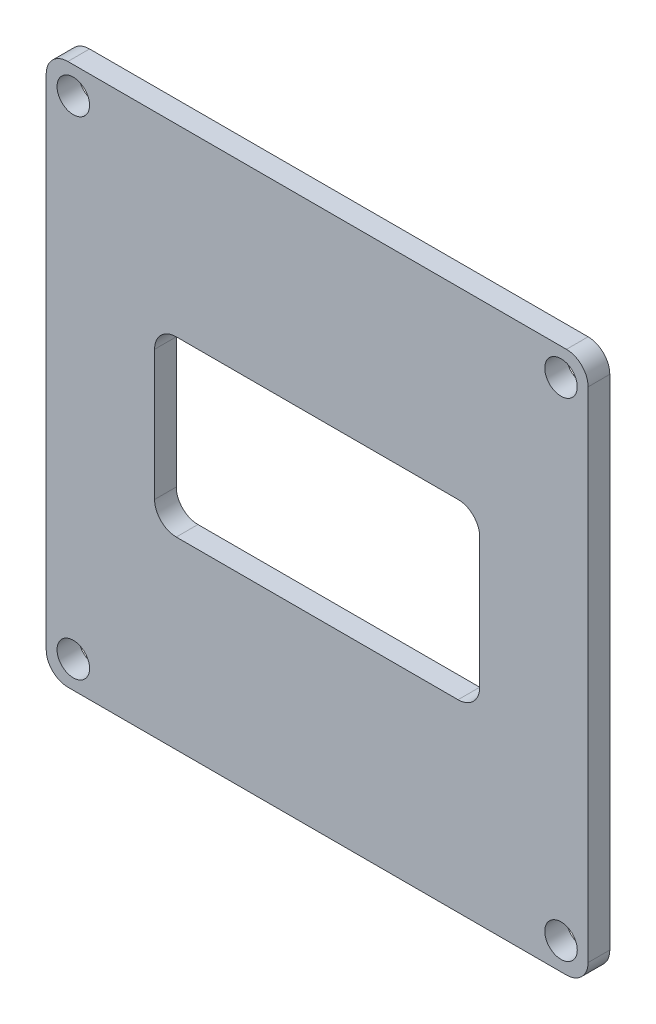
ISO-10303-21;
HEADER;
FILE_DESCRIPTION(('STEP AP214'),'2;1');
FILE_NAME('part.step','',(''),(''),'','','');
FILE_SCHEMA(('AUTOMOTIVE_DESIGN { 1 0 10303 214 1 1 1 1 }'));
ENDSEC;
DATA;
#1=APPLICATION_CONTEXT('core data for automotive mechanical design processes');
#2=APPLICATION_PROTOCOL_DEFINITION('international standard','automotive_design',2000,#1);
#3=PRODUCT_CONTEXT('',#1,'mechanical');
#4=PRODUCT('Part','Part','',(#3));
#5=PRODUCT_RELATED_PRODUCT_CATEGORY('part','',(#4));
#6=PRODUCT_DEFINITION_FORMATION('','',#4);
#7=PRODUCT_DEFINITION_CONTEXT('part definition',#1,'design');
#8=PRODUCT_DEFINITION('design','',#6,#7);
#9=PRODUCT_DEFINITION_SHAPE('','',#8);
#10=(LENGTH_UNIT() NAMED_UNIT(*) SI_UNIT(.MILLI.,.METRE.));
#11=(NAMED_UNIT(*) PLANE_ANGLE_UNIT() SI_UNIT($,.RADIAN.));
#12=(NAMED_UNIT(*) SI_UNIT($,.STERADIAN.) SOLID_ANGLE_UNIT());
#13=UNCERTAINTY_MEASURE_WITH_UNIT(LENGTH_MEASURE(1.E-05),#10,'distance_accuracy_value','');
#14=(GEOMETRIC_REPRESENTATION_CONTEXT(3) GLOBAL_UNCERTAINTY_ASSIGNED_CONTEXT((#13)) GLOBAL_UNIT_ASSIGNED_CONTEXT((#10,
#11,#12)) REPRESENTATION_CONTEXT('',''));
#15=CARTESIAN_POINT('',(0.,0.,0.));
#16=DIRECTION('',(0.,0.,1.));
#17=DIRECTION('',(1.,0.,0.));
#18=AXIS2_PLACEMENT_3D('',#15,#16,#17);
#19=CARTESIAN_POINT('',(-18.5310880829015,-22.1578677914294,2.));
#20=DIRECTION('',(0.,0.,-1.));
#21=DIRECTION('',(-1.,0.,0.));
#22=AXIS2_PLACEMENT_3D('',#19,#20,#21);
#23=CYLINDRICAL_SURFACE('',#22,2.);
#24=DIRECTION('',(0.,0.,-1.));
#25=VECTOR('',#24,1.);
#26=CARTESIAN_POINT('',(-18.5310880829015,-24.1578677914294,2.));
#27=LINE('',#26,#25);
#28=CARTESIAN_POINT('',(-18.5310880829015,-24.1578677914294,2.));
#29=VERTEX_POINT('',#28);
#30=CARTESIAN_POINT('',(-18.5310880829015,-24.1578677914294,0.));
#31=VERTEX_POINT('',#30);
#32=EDGE_CURVE('E262',#29,#31,#27,.T.);
#33=ORIENTED_EDGE('',*,*,#32,.F.);
#34=CARTESIAN_POINT('',(-18.5310880829015,-22.1578677914294,2.));
#35=DIRECTION('',(0.,0.,1.));
#36=DIRECTION('',(1.,0.,0.));
#37=AXIS2_PLACEMENT_3D('',#34,#35,#36);
#38=CIRCLE('',#37,2.);
#39=CARTESIAN_POINT('',(-20.5310880829015,-22.1578677914294,2.));
#40=VERTEX_POINT('',#39);
#41=EDGE_CURVE('E41',#40,#29,#38,.T.);
#42=ORIENTED_EDGE('',*,*,#41,.F.);
#43=DIRECTION('',(0.,0.,-1.));
#44=VECTOR('',#43,1.);
#45=CARTESIAN_POINT('',(-20.5310880829015,-22.1578677914294,2.));
#46=LINE('',#45,#44);
#47=CARTESIAN_POINT('',(-20.5310880829015,-22.1578677914294,0.));
#48=VERTEX_POINT('',#47);
#49=EDGE_CURVE('E265',#48,#40,#46,.F.);
#50=ORIENTED_EDGE('',*,*,#49,.F.);
#51=CARTESIAN_POINT('',(-18.5310880829015,-22.1578677914294,0.));
#52=DIRECTION('',(0.,0.,1.));
#53=DIRECTION('',(1.,0.,0.));
#54=AXIS2_PLACEMENT_3D('',#51,#52,#53);
#55=CIRCLE('',#54,2.);
#56=EDGE_CURVE('E11',#31,#48,#55,.F.);
#57=ORIENTED_EDGE('',*,*,#56,.F.);
#58=EDGE_LOOP('',(#33,#42,#50,#57));
#59=FACE_BOUND('',#58,.T.);
#60=ADVANCED_FACE('F34',(#59),#23,.T.);
#61=CARTESIAN_POINT('',(-18.5310880829015,23.8421322085706,2.));
#62=DIRECTION('',(0.,0.,1.));
#63=DIRECTION('',(1.,0.,0.));
#64=AXIS2_PLACEMENT_3D('',#61,#62,#63);
#65=CYLINDRICAL_SURFACE('',#64,2.);
#66=DIRECTION('',(0.,0.,1.));
#67=VECTOR('',#66,1.);
#68=CARTESIAN_POINT('',(-18.5310880829015,25.8421322085706,2.));
#69=LINE('',#68,#67);
#70=CARTESIAN_POINT('',(-18.5310880829016,25.8421322085706,0.));
#71=VERTEX_POINT('',#70);
#72=CARTESIAN_POINT('',(-18.5310880829016,25.8421322085706,2.));
#73=VERTEX_POINT('',#72);
#74=EDGE_CURVE('E252',#71,#73,#69,.T.);
#75=ORIENTED_EDGE('',*,*,#74,.F.);
#76=CARTESIAN_POINT('',(-18.5310880829015,23.8421322085706,0.));
#77=DIRECTION('',(0.,0.,1.));
#78=DIRECTION('',(1.,0.,0.));
#79=AXIS2_PLACEMENT_3D('',#76,#77,#78);
#80=CIRCLE('',#79,2.);
#81=CARTESIAN_POINT('',(-20.5310880829016,23.8421322085706,0.));
#82=VERTEX_POINT('',#81);
#83=EDGE_CURVE('E258',#82,#71,#80,.F.);
#84=ORIENTED_EDGE('',*,*,#83,.F.);
#85=DIRECTION('',(0.,0.,1.));
#86=VECTOR('',#85,1.);
#87=CARTESIAN_POINT('',(-20.5310880829016,23.8421322085706,2.));
#88=LINE('',#87,#86);
#89=CARTESIAN_POINT('',(-20.5310880829016,23.8421322085706,2.));
#90=VERTEX_POINT('',#89);
#91=EDGE_CURVE('E255',#90,#82,#88,.F.);
#92=ORIENTED_EDGE('',*,*,#91,.F.);
#93=CARTESIAN_POINT('',(-18.5310880829015,23.8421322085706,2.));
#94=DIRECTION('',(0.,0.,1.));
#95=DIRECTION('',(1.,0.,0.));
#96=AXIS2_PLACEMENT_3D('',#93,#94,#95);
#97=CIRCLE('',#96,2.);
#98=EDGE_CURVE('E260',#73,#90,#97,.T.);
#99=ORIENTED_EDGE('',*,*,#98,.F.);
#100=EDGE_LOOP('',(#75,#84,#92,#99));
#101=FACE_BOUND('',#100,.T.);
#102=ADVANCED_FACE('F295',(#101),#65,.T.);
#103=CARTESIAN_POINT('',(27.4689119170985,-22.1578677914294,2.));
#104=DIRECTION('',(0.,0.,-1.));
#105=DIRECTION('',(-1.,0.,0.));
#106=AXIS2_PLACEMENT_3D('',#103,#104,#105);
#107=CYLINDRICAL_SURFACE('',#106,2.);
#108=DIRECTION('',(0.,0.,-1.));
#109=VECTOR('',#108,1.);
#110=CARTESIAN_POINT('',(29.4689119170985,-22.1578677914294,2.));
#111=LINE('',#110,#109);
#112=CARTESIAN_POINT('',(29.4689119170985,-22.1578677914294,2.));
#113=VERTEX_POINT('',#112);
#114=CARTESIAN_POINT('',(29.4689119170985,-22.1578677914294,0.));
#115=VERTEX_POINT('',#114);
#116=EDGE_CURVE('E241',#113,#115,#111,.T.);
#117=ORIENTED_EDGE('',*,*,#116,.F.);
#118=CARTESIAN_POINT('',(27.4689119170985,-22.1578677914294,2.));
#119=DIRECTION('',(0.,0.,1.));
#120=DIRECTION('',(1.,0.,0.));
#121=AXIS2_PLACEMENT_3D('',#118,#119,#120);
#122=CIRCLE('',#121,2.);
#123=CARTESIAN_POINT('',(27.4689119170984,-24.1578677914294,2.));
#124=VERTEX_POINT('',#123);
#125=EDGE_CURVE('E247',#124,#113,#122,.T.);
#126=ORIENTED_EDGE('',*,*,#125,.F.);
#127=DIRECTION('',(0.,0.,-1.));
#128=VECTOR('',#127,1.);
#129=CARTESIAN_POINT('',(27.4689119170985,-24.1578677914294,2.));
#130=LINE('',#129,#128);
#131=CARTESIAN_POINT('',(27.4689119170984,-24.1578677914294,0.));
#132=VERTEX_POINT('',#131);
#133=EDGE_CURVE('E244',#132,#124,#130,.F.);
#134=ORIENTED_EDGE('',*,*,#133,.F.);
#135=CARTESIAN_POINT('',(27.4689119170985,-22.1578677914294,0.));
#136=DIRECTION('',(0.,0.,1.));
#137=DIRECTION('',(1.,0.,0.));
#138=AXIS2_PLACEMENT_3D('',#135,#136,#137);
#139=CIRCLE('',#138,2.);
#140=EDGE_CURVE('E249',#115,#132,#139,.F.);
#141=ORIENTED_EDGE('',*,*,#140,.F.);
#142=EDGE_LOOP('',(#117,#126,#134,#141));
#143=FACE_BOUND('',#142,.T.);
#144=ADVANCED_FACE('F277',(#143),#107,.T.);
#145=CARTESIAN_POINT('',(27.4689119170985,23.8421322085706,2.));
#146=DIRECTION('',(0.,0.,1.));
#147=DIRECTION('',(1.,0.,0.));
#148=AXIS2_PLACEMENT_3D('',#145,#146,#147);
#149=CYLINDRICAL_SURFACE('',#148,2.);
#150=DIRECTION('',(0.,0.,1.));
#151=VECTOR('',#150,1.);
#152=CARTESIAN_POINT('',(29.4689119170985,23.8421322085706,2.));
#153=LINE('',#152,#151);
#154=CARTESIAN_POINT('',(29.4689119170985,23.8421322085706,0.));
#155=VERTEX_POINT('',#154);
#156=CARTESIAN_POINT('',(29.4689119170985,23.8421322085706,2.));
#157=VERTEX_POINT('',#156);
#158=EDGE_CURVE('E230',#155,#157,#153,.T.);
#159=ORIENTED_EDGE('',*,*,#158,.F.);
#160=CARTESIAN_POINT('',(27.4689119170985,23.8421322085706,0.));
#161=DIRECTION('',(0.,0.,1.));
#162=DIRECTION('',(1.,0.,0.));
#163=AXIS2_PLACEMENT_3D('',#160,#161,#162);
#164=CIRCLE('',#163,2.);
#165=CARTESIAN_POINT('',(27.4689119170985,25.8421322085706,0.));
#166=VERTEX_POINT('',#165);
#167=EDGE_CURVE('E236',#166,#155,#164,.F.);
#168=ORIENTED_EDGE('',*,*,#167,.F.);
#169=DIRECTION('',(0.,0.,1.));
#170=VECTOR('',#169,1.);
#171=CARTESIAN_POINT('',(27.4689119170985,25.8421322085706,2.));
#172=LINE('',#171,#170);
#173=CARTESIAN_POINT('',(27.4689119170985,25.8421322085706,2.));
#174=VERTEX_POINT('',#173);
#175=EDGE_CURVE('E233',#174,#166,#172,.F.);
#176=ORIENTED_EDGE('',*,*,#175,.F.);
#177=CARTESIAN_POINT('',(27.4689119170985,23.8421322085706,2.));
#178=DIRECTION('',(0.,0.,1.));
#179=DIRECTION('',(1.,0.,0.));
#180=AXIS2_PLACEMENT_3D('',#177,#178,#179);
#181=CIRCLE('',#180,2.);
#182=EDGE_CURVE('E239',#157,#174,#181,.T.);
#183=ORIENTED_EDGE('',*,*,#182,.F.);
#184=EDGE_LOOP('',(#159,#168,#176,#183));
#185=FACE_BOUND('',#184,.T.);
#186=ADVANCED_FACE('F284',(#185),#149,.T.);
#187=CARTESIAN_POINT('',(-8.53108808290154,-5.15786779142943,2.));
#188=DIRECTION('',(0.,0.,1.));
#189=DIRECTION('',(1.,0.,0.));
#190=AXIS2_PLACEMENT_3D('',#187,#188,#189);
#191=CYLINDRICAL_SURFACE('',#190,2.);
#192=DIRECTION('',(0.,0.,-1.));
#193=VECTOR('',#192,1.);
#194=CARTESIAN_POINT('',(-10.5310880829015,-5.15786779142943,2.));
#195=LINE('',#194,#193);
#196=CARTESIAN_POINT('',(-10.5310880829015,-5.15786779142943,2.));
#197=VERTEX_POINT('',#196);
#198=CARTESIAN_POINT('',(-10.5310880829015,-5.15786779142943,0.));
#199=VERTEX_POINT('',#198);
#200=EDGE_CURVE('E220',#197,#199,#195,.T.);
#201=ORIENTED_EDGE('',*,*,#200,.F.);
#202=CARTESIAN_POINT('',(-8.53108808290154,-5.15786779142943,2.));
#203=DIRECTION('',(0.,0.,1.));
#204=DIRECTION('',(1.,0.,0.));
#205=AXIS2_PLACEMENT_3D('',#202,#203,#204);
#206=CIRCLE('',#205,2.);
#207=CARTESIAN_POINT('',(-8.53108808290154,-7.15786779142943,2.));
#208=VERTEX_POINT('',#207);
#209=EDGE_CURVE('E226',#197,#208,#206,.T.);
#210=ORIENTED_EDGE('',*,*,#209,.T.);
#211=DIRECTION('',(0.,0.,-1.));
#212=VECTOR('',#211,1.);
#213=CARTESIAN_POINT('',(-8.53108808290154,-7.15786779142943,2.));
#214=LINE('',#213,#212);
#215=CARTESIAN_POINT('',(-8.53108808290154,-7.15786779142943,0.));
#216=VERTEX_POINT('',#215);
#217=EDGE_CURVE('E223',#216,#208,#214,.F.);
#218=ORIENTED_EDGE('',*,*,#217,.F.);
#219=CARTESIAN_POINT('',(-8.53108808290154,-5.15786779142943,0.));
#220=DIRECTION('',(0.,0.,1.));
#221=DIRECTION('',(1.,0.,0.));
#222=AXIS2_PLACEMENT_3D('',#219,#220,#221);
#223=CIRCLE('',#222,2.);
#224=EDGE_CURVE('E228',#216,#199,#223,.F.);
#225=ORIENTED_EDGE('',*,*,#224,.T.);
#226=EDGE_LOOP('',(#201,#210,#218,#225));
#227=FACE_BOUND('',#226,.T.);
#228=ADVANCED_FACE('F318',(#227),#191,.F.);
#229=CARTESIAN_POINT('',(-8.53108808290154,6.84213220857057,2.));
#230=DIRECTION('',(0.,0.,1.));
#231=DIRECTION('',(1.,0.,0.));
#232=AXIS2_PLACEMENT_3D('',#229,#230,#231);
#233=CYLINDRICAL_SURFACE('',#232,2.);
#234=DIRECTION('',(0.,0.,-1.));
#235=VECTOR('',#234,1.);
#236=CARTESIAN_POINT('',(-8.53108808290154,8.84213220857057,2.));
#237=LINE('',#236,#235);
#238=CARTESIAN_POINT('',(-8.53108808290154,8.84213220857057,2.));
#239=VERTEX_POINT('',#238);
#240=CARTESIAN_POINT('',(-8.53108808290154,8.84213220857057,0.));
#241=VERTEX_POINT('',#240);
#242=EDGE_CURVE('E169',#239,#241,#237,.T.);
#243=ORIENTED_EDGE('',*,*,#242,.F.);
#244=CARTESIAN_POINT('',(-8.53108808290154,6.84213220857057,2.));
#245=DIRECTION('',(0.,0.,1.));
#246=DIRECTION('',(1.,0.,0.));
#247=AXIS2_PLACEMENT_3D('',#244,#245,#246);
#248=CIRCLE('',#247,2.);
#249=CARTESIAN_POINT('',(-10.5310880829015,6.84213220857057,2.));
#250=VERTEX_POINT('',#249);
#251=EDGE_CURVE('E216',#239,#250,#248,.T.);
#252=ORIENTED_EDGE('',*,*,#251,.T.);
#253=DIRECTION('',(0.,0.,-1.));
#254=VECTOR('',#253,1.);
#255=CARTESIAN_POINT('',(-10.5310880829015,6.84213220857057,2.));
#256=LINE('',#255,#254);
#257=CARTESIAN_POINT('',(-10.5310880829015,6.84213220857057,0.));
#258=VERTEX_POINT('',#257);
#259=EDGE_CURVE('E213',#258,#250,#256,.F.);
#260=ORIENTED_EDGE('',*,*,#259,.F.);
#261=CARTESIAN_POINT('',(-8.53108808290154,6.84213220857057,0.));
#262=DIRECTION('',(0.,0.,1.));
#263=DIRECTION('',(1.,0.,0.));
#264=AXIS2_PLACEMENT_3D('',#261,#262,#263);
#265=CIRCLE('',#264,2.);
#266=EDGE_CURVE('E218',#258,#241,#265,.F.);
#267=ORIENTED_EDGE('',*,*,#266,.T.);
#268=EDGE_LOOP('',(#243,#252,#260,#267));
#269=FACE_BOUND('',#268,.T.);
#270=ADVANCED_FACE('F321',(#269),#233,.F.);
#271=CARTESIAN_POINT('',(17.4689119170985,-5.15786779142943,2.));
#272=DIRECTION('',(0.,0.,-1.));
#273=DIRECTION('',(-1.,0.,0.));
#274=AXIS2_PLACEMENT_3D('',#271,#272,#273);
#275=CYLINDRICAL_SURFACE('',#274,2.);
#276=DIRECTION('',(0.,0.,1.));
#277=VECTOR('',#276,1.);
#278=CARTESIAN_POINT('',(19.4689119170985,-5.15786779142943,2.));
#279=LINE('',#278,#277);
#280=CARTESIAN_POINT('',(19.4689119170985,-5.15786779142943,0.));
#281=VERTEX_POINT('',#280);
#282=CARTESIAN_POINT('',(19.4689119170985,-5.15786779142943,2.));
#283=VERTEX_POINT('',#282);
#284=EDGE_CURVE('E201',#281,#283,#279,.T.);
#285=ORIENTED_EDGE('',*,*,#284,.F.);
#286=CARTESIAN_POINT('',(17.4689119170985,-5.15786779142943,0.));
#287=DIRECTION('',(0.,0.,1.));
#288=DIRECTION('',(1.,0.,0.));
#289=AXIS2_PLACEMENT_3D('',#286,#287,#288);
#290=CIRCLE('',#289,2.);
#291=CARTESIAN_POINT('',(17.4689119170985,-7.15786779142943,0.));
#292=VERTEX_POINT('',#291);
#293=EDGE_CURVE('E207',#281,#292,#290,.F.);
#294=ORIENTED_EDGE('',*,*,#293,.T.);
#295=DIRECTION('',(0.,0.,1.));
#296=VECTOR('',#295,1.);
#297=CARTESIAN_POINT('',(17.4689119170985,-7.15786779142943,2.));
#298=LINE('',#297,#296);
#299=CARTESIAN_POINT('',(17.4689119170985,-7.15786779142943,2.));
#300=VERTEX_POINT('',#299);
#301=EDGE_CURVE('E204',#300,#292,#298,.F.);
#302=ORIENTED_EDGE('',*,*,#301,.F.);
#303=CARTESIAN_POINT('',(17.4689119170985,-5.15786779142943,2.));
#304=DIRECTION('',(0.,0.,1.));
#305=DIRECTION('',(1.,0.,0.));
#306=AXIS2_PLACEMENT_3D('',#303,#304,#305);
#307=CIRCLE('',#306,2.);
#308=EDGE_CURVE('E210',#300,#283,#307,.T.);
#309=ORIENTED_EDGE('',*,*,#308,.T.);
#310=EDGE_LOOP('',(#285,#294,#302,#309));
#311=FACE_BOUND('',#310,.T.);
#312=ADVANCED_FACE('F325',(#311),#275,.F.);
#313=CARTESIAN_POINT('',(17.4689119170985,6.84213220857057,2.));
#314=DIRECTION('',(0.,0.,-1.));
#315=DIRECTION('',(-1.,0.,0.));
#316=AXIS2_PLACEMENT_3D('',#313,#314,#315);
#317=CYLINDRICAL_SURFACE('',#316,2.);
#318=DIRECTION('',(0.,0.,1.));
#319=VECTOR('',#318,1.);
#320=CARTESIAN_POINT('',(17.4689119170985,8.84213220857057,2.));
#321=LINE('',#320,#319);
#322=CARTESIAN_POINT('',(17.4689119170985,8.84213220857057,0.));
#323=VERTEX_POINT('',#322);
#324=CARTESIAN_POINT('',(17.4689119170985,8.84213220857057,2.));
#325=VERTEX_POINT('',#324);
#326=EDGE_CURVE('E158',#323,#325,#321,.T.);
#327=ORIENTED_EDGE('',*,*,#326,.F.);
#328=CARTESIAN_POINT('',(17.4689119170985,6.84213220857057,0.));
#329=DIRECTION('',(0.,0.,1.));
#330=DIRECTION('',(1.,0.,0.));
#331=AXIS2_PLACEMENT_3D('',#328,#329,#330);
#332=CIRCLE('',#331,2.);
#333=CARTESIAN_POINT('',(19.4689119170985,6.84213220857057,0.));
#334=VERTEX_POINT('',#333);
#335=EDGE_CURVE('E144',#323,#334,#332,.F.);
#336=ORIENTED_EDGE('',*,*,#335,.T.);
#337=DIRECTION('',(0.,0.,1.));
#338=VECTOR('',#337,1.);
#339=CARTESIAN_POINT('',(19.4689119170985,6.84213220857057,2.));
#340=LINE('',#339,#338);
#341=CARTESIAN_POINT('',(19.4689119170985,6.84213220857057,2.));
#342=VERTEX_POINT('',#341);
#343=EDGE_CURVE('E155',#342,#334,#340,.F.);
#344=ORIENTED_EDGE('',*,*,#343,.F.);
#345=CARTESIAN_POINT('',(17.4689119170985,6.84213220857057,2.));
#346=DIRECTION('',(0.,0.,1.));
#347=DIRECTION('',(1.,0.,0.));
#348=AXIS2_PLACEMENT_3D('',#345,#346,#347);
#349=CIRCLE('',#348,2.);
#350=EDGE_CURVE('E154',#342,#325,#349,.T.);
#351=ORIENTED_EDGE('',*,*,#350,.T.);
#352=EDGE_LOOP('',(#327,#336,#344,#351));
#353=FACE_BOUND('',#352,.T.);
#354=ADVANCED_FACE('F159',(#353),#317,.F.);
#355=CARTESIAN_POINT('',(0.,0.,2.));
#356=DIRECTION('',(0.,0.,1.));
#357=DIRECTION('',(1.,0.,0.));
#358=AXIS2_PLACEMENT_3D('',#355,#356,#357);
#359=PLANE('',#358);
#360=CARTESIAN_POINT('',(26.9689119170985,-21.6578677914294,2.));
#361=DIRECTION('',(0.,0.,1.));
#362=DIRECTION('',(1.,0.,0.));
#363=AXIS2_PLACEMENT_3D('',#360,#361,#362);
#364=CIRCLE('',#363,1.5);
#365=CARTESIAN_POINT('',(28.4689119170985,-21.6578677914294,2.));
#366=VERTEX_POINT('',#365);
#367=EDGE_CURVE('E507',#366,#366,#364,.T.);
#368=ORIENTED_EDGE('',*,*,#367,.F.);
#369=EDGE_LOOP('',(#368));
#370=FACE_BOUND('',#369,.T.);
#371=CARTESIAN_POINT('',(-18.0310880829016,23.3421322085706,2.));
#372=DIRECTION('',(0.,0.,1.));
#373=DIRECTION('',(1.,0.,0.));
#374=AXIS2_PLACEMENT_3D('',#371,#372,#373);
#375=CIRCLE('',#374,1.5);
#376=CARTESIAN_POINT('',(-16.5310880829016,23.3421322085706,2.));
#377=VERTEX_POINT('',#376);
#378=EDGE_CURVE('E519',#377,#377,#375,.T.);
#379=ORIENTED_EDGE('',*,*,#378,.F.);
#380=EDGE_LOOP('',(#379));
#381=FACE_BOUND('',#380,.T.);
#382=DIRECTION('',(0.,-1.,0.));
#383=VECTOR('',#382,1.);
#384=CARTESIAN_POINT('',(-20.5310880829016,25.8421322085706,2.));
#385=LINE('',#384,#383);
#386=EDGE_CURVE('E179',#90,#40,#385,.T.);
#387=ORIENTED_EDGE('',*,*,#386,.T.);
#388=ORIENTED_EDGE('',*,*,#41,.T.);
#389=DIRECTION('',(1.,0.,0.));
#390=VECTOR('',#389,1.);
#391=CARTESIAN_POINT('',(-20.5310880829015,-24.1578677914294,2.));
#392=LINE('',#391,#390);
#393=EDGE_CURVE('E182',#29,#124,#392,.T.);
#394=ORIENTED_EDGE('',*,*,#393,.T.);
#395=ORIENTED_EDGE('',*,*,#125,.T.);
#396=DIRECTION('',(0.,1.,0.));
#397=VECTOR('',#396,1.);
#398=CARTESIAN_POINT('',(29.4689119170985,25.8421322085706,2.));
#399=LINE('',#398,#397);
#400=EDGE_CURVE('E185',#113,#157,#399,.T.);
#401=ORIENTED_EDGE('',*,*,#400,.T.);
#402=ORIENTED_EDGE('',*,*,#182,.T.);
#403=DIRECTION('',(-1.,0.,0.));
#404=VECTOR('',#403,1.);
#405=CARTESIAN_POINT('',(-20.5310880829016,25.8421322085706,2.));
#406=LINE('',#405,#404);
#407=EDGE_CURVE('E164',#174,#73,#406,.T.);
#408=ORIENTED_EDGE('',*,*,#407,.T.);
#409=ORIENTED_EDGE('',*,*,#98,.T.);
#410=EDGE_LOOP('',(#387,#388,#394,#395,#401,#402,#408,#409));
#411=FACE_BOUND('',#410,.T.);
#412=DIRECTION('',(1.,0.,0.));
#413=VECTOR('',#412,1.);
#414=CARTESIAN_POINT('',(-10.5310880829015,-7.15786779142943,2.));
#415=LINE('',#414,#413);
#416=EDGE_CURVE('E173',#208,#300,#415,.T.);
#417=ORIENTED_EDGE('',*,*,#416,.F.);
#418=ORIENTED_EDGE('',*,*,#209,.F.);
#419=DIRECTION('',(0.,-1.,0.));
#420=VECTOR('',#419,1.);
#421=CARTESIAN_POINT('',(-10.5310880829015,8.84213220857057,2.));
#422=LINE('',#421,#420);
#423=EDGE_CURVE('E170',#250,#197,#422,.T.);
#424=ORIENTED_EDGE('',*,*,#423,.F.);
#425=ORIENTED_EDGE('',*,*,#251,.F.);
#426=DIRECTION('',(-1.,0.,0.));
#427=VECTOR('',#426,1.);
#428=CARTESIAN_POINT('',(-10.5310880829015,8.84213220857057,2.));
#429=LINE('',#428,#427);
#430=EDGE_CURVE('E193',#325,#239,#429,.T.);
#431=ORIENTED_EDGE('',*,*,#430,.F.);
#432=ORIENTED_EDGE('',*,*,#350,.F.);
#433=DIRECTION('',(0.,1.,0.));
#434=VECTOR('',#433,1.);
#435=CARTESIAN_POINT('',(19.4689119170985,8.84213220857057,2.));
#436=LINE('',#435,#434);
#437=EDGE_CURVE('E526',#283,#342,#436,.T.);
#438=ORIENTED_EDGE('',*,*,#437,.F.);
#439=ORIENTED_EDGE('',*,*,#308,.F.);
#440=EDGE_LOOP('',(#417,#418,#424,#425,#431,#432,#438,#439));
#441=FACE_BOUND('',#440,.T.);
#442=CARTESIAN_POINT('',(26.9689119170985,23.3421322085706,2.));
#443=DIRECTION('',(0.,0.,1.));
#444=DIRECTION('',(-1.,0.,0.));
#445=AXIS2_PLACEMENT_3D('',#442,#443,#444);
#446=CIRCLE('',#445,1.5);
#447=CARTESIAN_POINT('',(25.4689119170985,23.3421322085706,2.));
#448=VERTEX_POINT('',#447);
#449=EDGE_CURVE('E513',#448,#448,#446,.T.);
#450=ORIENTED_EDGE('',*,*,#449,.F.);
#451=EDGE_LOOP('',(#450));
#452=FACE_BOUND('',#451,.T.);
#453=CARTESIAN_POINT('',(-18.0310880829016,-21.6578677914294,2.));
#454=DIRECTION('',(0.,0.,1.));
#455=DIRECTION('',(-1.,0.,0.));
#456=AXIS2_PLACEMENT_3D('',#453,#454,#455);
#457=CIRCLE('',#456,1.5);
#458=CARTESIAN_POINT('',(-19.5310880829016,-21.6578677914294,2.));
#459=VERTEX_POINT('',#458);
#460=EDGE_CURVE('E498',#459,#459,#457,.T.);
#461=ORIENTED_EDGE('',*,*,#460,.F.);
#462=EDGE_LOOP('',(#461));
#463=FACE_BOUND('',#462,.T.);
#464=ADVANCED_FACE('F267',(#370,#381,#411,#441,#452,#463),#359,.T.);
#465=CARTESIAN_POINT('',(0.,0.,0.));
#466=DIRECTION('',(0.,0.,1.));
#467=DIRECTION('',(1.,0.,0.));
#468=AXIS2_PLACEMENT_3D('',#465,#466,#467);
#469=PLANE('',#468);
#470=ORIENTED_EDGE('',*,*,#224,.F.);
#471=DIRECTION('',(1.,0.,0.));
#472=VECTOR('',#471,1.);
#473=CARTESIAN_POINT('',(-10.5310880829015,-7.15786779142943,0.));
#474=LINE('',#473,#472);
#475=EDGE_CURVE('E175',#216,#292,#474,.T.);
#476=ORIENTED_EDGE('',*,*,#475,.T.);
#477=ORIENTED_EDGE('',*,*,#293,.F.);
#478=DIRECTION('',(0.,1.,0.));
#479=VECTOR('',#478,1.);
#480=CARTESIAN_POINT('',(19.4689119170985,8.84213220857057,0.));
#481=LINE('',#480,#479);
#482=EDGE_CURVE('E150',#281,#334,#481,.T.);
#483=ORIENTED_EDGE('',*,*,#482,.T.);
#484=ORIENTED_EDGE('',*,*,#335,.F.);
#485=DIRECTION('',(-1.,0.,0.));
#486=VECTOR('',#485,1.);
#487=CARTESIAN_POINT('',(-10.5310880829015,8.84213220857057,0.));
#488=LINE('',#487,#486);
#489=EDGE_CURVE('E148',#323,#241,#488,.T.);
#490=ORIENTED_EDGE('',*,*,#489,.T.);
#491=ORIENTED_EDGE('',*,*,#266,.F.);
#492=DIRECTION('',(0.,-1.,0.));
#493=VECTOR('',#492,1.);
#494=CARTESIAN_POINT('',(-10.5310880829015,8.84213220857057,0.));
#495=LINE('',#494,#493);
#496=EDGE_CURVE('E522',#258,#199,#495,.T.);
#497=ORIENTED_EDGE('',*,*,#496,.T.);
#498=EDGE_LOOP('',(#470,#476,#477,#483,#484,#490,#491,#497));
#499=FACE_BOUND('',#498,.T.);
#500=DIRECTION('',(1.,0.,0.));
#501=VECTOR('',#500,1.);
#502=CARTESIAN_POINT('',(-20.5310880829015,-24.1578677914294,0.));
#503=LINE('',#502,#501);
#504=EDGE_CURVE('E192',#31,#132,#503,.T.);
#505=ORIENTED_EDGE('',*,*,#504,.F.);
#506=ORIENTED_EDGE('',*,*,#56,.T.);
#507=DIRECTION('',(0.,-1.,0.));
#508=VECTOR('',#507,1.);
#509=CARTESIAN_POINT('',(-20.5310880829016,25.8421322085706,0.));
#510=LINE('',#509,#508);
#511=EDGE_CURVE('E189',#82,#48,#510,.T.);
#512=ORIENTED_EDGE('',*,*,#511,.F.);
#513=ORIENTED_EDGE('',*,*,#83,.T.);
#514=DIRECTION('',(-1.,0.,0.));
#515=VECTOR('',#514,1.);
#516=CARTESIAN_POINT('',(-20.5310880829016,25.8421322085706,0.));
#517=LINE('',#516,#515);
#518=EDGE_CURVE('E183',#166,#71,#517,.T.);
#519=ORIENTED_EDGE('',*,*,#518,.F.);
#520=ORIENTED_EDGE('',*,*,#167,.T.);
#521=DIRECTION('',(0.,1.,0.));
#522=VECTOR('',#521,1.);
#523=CARTESIAN_POINT('',(29.4689119170985,25.8421322085706,0.));
#524=LINE('',#523,#522);
#525=EDGE_CURVE('E195',#115,#155,#524,.T.);
#526=ORIENTED_EDGE('',*,*,#525,.F.);
#527=ORIENTED_EDGE('',*,*,#140,.T.);
#528=EDGE_LOOP('',(#505,#506,#512,#513,#519,#520,#526,#527));
#529=FACE_BOUND('',#528,.T.);
#530=CARTESIAN_POINT('',(-18.0310880829016,23.3421322085706,0.));
#531=DIRECTION('',(0.,0.,1.));
#532=DIRECTION('',(1.,0.,0.));
#533=AXIS2_PLACEMENT_3D('',#530,#531,#532);
#534=CIRCLE('',#533,1.5);
#535=CARTESIAN_POINT('',(-16.5310880829016,23.3421322085706,0.));
#536=VERTEX_POINT('',#535);
#537=EDGE_CURVE('E516',#536,#536,#534,.T.);
#538=ORIENTED_EDGE('',*,*,#537,.T.);
#539=EDGE_LOOP('',(#538));
#540=FACE_BOUND('',#539,.T.);
#541=CARTESIAN_POINT('',(26.9689119170985,23.3421322085706,0.));
#542=DIRECTION('',(0.,0.,1.));
#543=DIRECTION('',(-1.,0.,0.));
#544=AXIS2_PLACEMENT_3D('',#541,#542,#543);
#545=CIRCLE('',#544,1.5);
#546=CARTESIAN_POINT('',(25.4689119170985,23.3421322085706,0.));
#547=VERTEX_POINT('',#546);
#548=EDGE_CURVE('E510',#547,#547,#545,.T.);
#549=ORIENTED_EDGE('',*,*,#548,.T.);
#550=EDGE_LOOP('',(#549));
#551=FACE_BOUND('',#550,.T.);
#552=CARTESIAN_POINT('',(26.9689119170985,-21.6578677914294,0.));
#553=DIRECTION('',(0.,0.,1.));
#554=DIRECTION('',(1.,0.,0.));
#555=AXIS2_PLACEMENT_3D('',#552,#553,#554);
#556=CIRCLE('',#555,1.5);
#557=CARTESIAN_POINT('',(28.4689119170985,-21.6578677914294,0.));
#558=VERTEX_POINT('',#557);
#559=EDGE_CURVE('E504',#558,#558,#556,.T.);
#560=ORIENTED_EDGE('',*,*,#559,.T.);
#561=EDGE_LOOP('',(#560));
#562=FACE_BOUND('',#561,.T.);
#563=CARTESIAN_POINT('',(-18.0310880829016,-21.6578677914294,0.));
#564=DIRECTION('',(0.,0.,1.));
#565=DIRECTION('',(-1.,0.,0.));
#566=AXIS2_PLACEMENT_3D('',#563,#564,#565);
#567=CIRCLE('',#566,1.5);
#568=CARTESIAN_POINT('',(-19.5310880829016,-21.6578677914294,0.));
#569=VERTEX_POINT('',#568);
#570=EDGE_CURVE('E501',#569,#569,#567,.T.);
#571=ORIENTED_EDGE('',*,*,#570,.T.);
#572=EDGE_LOOP('',(#571));
#573=FACE_BOUND('',#572,.T.);
#574=ADVANCED_FACE('F146',(#499,#529,#540,#551,#562,#573),#469,.F.);
#575=CARTESIAN_POINT('',(-20.5310880829016,25.8421322085706,2.));
#576=DIRECTION('',(1.,0.,0.));
#577=DIRECTION('',(0.,1.,0.));
#578=AXIS2_PLACEMENT_3D('',#575,#576,#577);
#579=PLANE('',#578);
#580=ORIENTED_EDGE('',*,*,#511,.T.);
#581=ORIENTED_EDGE('',*,*,#49,.T.);
#582=ORIENTED_EDGE('',*,*,#386,.F.);
#583=ORIENTED_EDGE('',*,*,#91,.T.);
#584=EDGE_LOOP('',(#580,#581,#582,#583));
#585=FACE_BOUND('',#584,.T.);
#586=ADVANCED_FACE('F297',(#585),#579,.F.);
#587=CARTESIAN_POINT('',(-20.5310880829015,-24.1578677914294,2.));
#588=DIRECTION('',(0.,1.,0.));
#589=DIRECTION('',(0.,0.,1.));
#590=AXIS2_PLACEMENT_3D('',#587,#588,#589);
#591=PLANE('',#590);
#592=ORIENTED_EDGE('',*,*,#393,.F.);
#593=ORIENTED_EDGE('',*,*,#32,.T.);
#594=ORIENTED_EDGE('',*,*,#504,.T.);
#595=ORIENTED_EDGE('',*,*,#133,.T.);
#596=EDGE_LOOP('',(#592,#593,#594,#595));
#597=FACE_BOUND('',#596,.T.);
#598=ADVANCED_FACE('F273',(#597),#591,.F.);
#599=CARTESIAN_POINT('',(29.4689119170985,25.8421322085706,2.));
#600=DIRECTION('',(-1.,0.,0.));
#601=DIRECTION('',(0.,0.,1.));
#602=AXIS2_PLACEMENT_3D('',#599,#600,#601);
#603=PLANE('',#602);
#604=ORIENTED_EDGE('',*,*,#400,.F.);
#605=ORIENTED_EDGE('',*,*,#116,.T.);
#606=ORIENTED_EDGE('',*,*,#525,.T.);
#607=ORIENTED_EDGE('',*,*,#158,.T.);
#608=EDGE_LOOP('',(#604,#605,#606,#607));
#609=FACE_BOUND('',#608,.T.);
#610=ADVANCED_FACE('F286',(#609),#603,.F.);
#611=CARTESIAN_POINT('',(-20.5310880829016,25.8421322085706,2.));
#612=DIRECTION('',(0.,-1.,0.));
#613=DIRECTION('',(1.,0.,0.));
#614=AXIS2_PLACEMENT_3D('',#611,#612,#613);
#615=PLANE('',#614);
#616=ORIENTED_EDGE('',*,*,#518,.T.);
#617=ORIENTED_EDGE('',*,*,#74,.T.);
#618=ORIENTED_EDGE('',*,*,#407,.F.);
#619=ORIENTED_EDGE('',*,*,#175,.T.);
#620=EDGE_LOOP('',(#616,#617,#618,#619));
#621=FACE_BOUND('',#620,.T.);
#622=ADVANCED_FACE('F291',(#621),#615,.F.);
#623=CARTESIAN_POINT('',(-10.5310880829015,8.84213220857057,2.));
#624=DIRECTION('',(1.,0.,0.));
#625=DIRECTION('',(0.,0.,-1.));
#626=AXIS2_PLACEMENT_3D('',#623,#624,#625);
#627=PLANE('',#626);
#628=ORIENTED_EDGE('',*,*,#423,.T.);
#629=ORIENTED_EDGE('',*,*,#200,.T.);
#630=ORIENTED_EDGE('',*,*,#496,.F.);
#631=ORIENTED_EDGE('',*,*,#259,.T.);
#632=EDGE_LOOP('',(#628,#629,#630,#631));
#633=FACE_BOUND('',#632,.T.);
#634=ADVANCED_FACE('F340',(#633),#627,.T.);
#635=CARTESIAN_POINT('',(-10.5310880829015,-7.15786779142943,2.));
#636=DIRECTION('',(0.,1.,0.));
#637=DIRECTION('',(-1.,0.,0.));
#638=AXIS2_PLACEMENT_3D('',#635,#636,#637);
#639=PLANE('',#638);
#640=ORIENTED_EDGE('',*,*,#475,.F.);
#641=ORIENTED_EDGE('',*,*,#217,.T.);
#642=ORIENTED_EDGE('',*,*,#416,.T.);
#643=ORIENTED_EDGE('',*,*,#301,.T.);
#644=EDGE_LOOP('',(#640,#641,#642,#643));
#645=FACE_BOUND('',#644,.T.);
#646=ADVANCED_FACE('F361',(#645),#639,.T.);
#647=CARTESIAN_POINT('',(19.4689119170985,8.84213220857057,2.));
#648=DIRECTION('',(-1.,0.,0.));
#649=DIRECTION('',(0.,0.,1.));
#650=AXIS2_PLACEMENT_3D('',#647,#648,#649);
#651=PLANE('',#650);
#652=ORIENTED_EDGE('',*,*,#482,.F.);
#653=ORIENTED_EDGE('',*,*,#284,.T.);
#654=ORIENTED_EDGE('',*,*,#437,.T.);
#655=ORIENTED_EDGE('',*,*,#343,.T.);
#656=EDGE_LOOP('',(#652,#653,#654,#655));
#657=FACE_BOUND('',#656,.T.);
#658=ADVANCED_FACE('F369',(#657),#651,.T.);
#659=CARTESIAN_POINT('',(-10.5310880829015,8.84213220857057,2.));
#660=DIRECTION('',(0.,-1.,0.));
#661=DIRECTION('',(0.,0.,-1.));
#662=AXIS2_PLACEMENT_3D('',#659,#660,#661);
#663=PLANE('',#662);
#664=ORIENTED_EDGE('',*,*,#430,.T.);
#665=ORIENTED_EDGE('',*,*,#242,.T.);
#666=ORIENTED_EDGE('',*,*,#489,.F.);
#667=ORIENTED_EDGE('',*,*,#326,.T.);
#668=EDGE_LOOP('',(#664,#665,#666,#667));
#669=FACE_BOUND('',#668,.T.);
#670=ADVANCED_FACE('F167',(#669),#663,.T.);
#671=CARTESIAN_POINT('',(-18.0310880829016,23.3421322085706,2.));
#672=DIRECTION('',(0.,0.,-1.));
#673=DIRECTION('',(-1.,0.,0.));
#674=AXIS2_PLACEMENT_3D('',#671,#672,#673);
#675=CYLINDRICAL_SURFACE('',#674,1.5);
#676=ORIENTED_EDGE('',*,*,#378,.T.);
#677=EDGE_LOOP('',(#676));
#678=FACE_BOUND('',#677,.T.);
#679=ORIENTED_EDGE('',*,*,#537,.F.);
#680=EDGE_LOOP('',(#679));
#681=FACE_BOUND('',#680,.T.);
#682=ADVANCED_FACE('F386',(#678,#681),#675,.F.);
#683=CARTESIAN_POINT('',(26.9689119170985,23.3421322085706,2.));
#684=DIRECTION('',(0.,0.,-1.));
#685=DIRECTION('',(-1.,0.,0.));
#686=AXIS2_PLACEMENT_3D('',#683,#684,#685);
#687=CYLINDRICAL_SURFACE('',#686,1.5);
#688=ORIENTED_EDGE('',*,*,#449,.T.);
#689=EDGE_LOOP('',(#688));
#690=FACE_BOUND('',#689,.T.);
#691=ORIENTED_EDGE('',*,*,#548,.F.);
#692=EDGE_LOOP('',(#691));
#693=FACE_BOUND('',#692,.T.);
#694=ADVANCED_FACE('F393',(#690,#693),#687,.F.);
#695=CARTESIAN_POINT('',(26.9689119170985,-21.6578677914294,2.));
#696=DIRECTION('',(0.,0.,-1.));
#697=DIRECTION('',(-1.,0.,0.));
#698=AXIS2_PLACEMENT_3D('',#695,#696,#697);
#699=CYLINDRICAL_SURFACE('',#698,1.5);
#700=ORIENTED_EDGE('',*,*,#367,.T.);
#701=EDGE_LOOP('',(#700));
#702=FACE_BOUND('',#701,.T.);
#703=ORIENTED_EDGE('',*,*,#559,.F.);
#704=EDGE_LOOP('',(#703));
#705=FACE_BOUND('',#704,.T.);
#706=ADVANCED_FACE('F401',(#702,#705),#699,.F.);
#707=CARTESIAN_POINT('',(-18.0310880829016,-21.6578677914294,2.));
#708=DIRECTION('',(0.,0.,-1.));
#709=DIRECTION('',(-1.,0.,0.));
#710=AXIS2_PLACEMENT_3D('',#707,#708,#709);
#711=CYLINDRICAL_SURFACE('',#710,1.5);
#712=ORIENTED_EDGE('',*,*,#460,.T.);
#713=EDGE_LOOP('',(#712));
#714=FACE_BOUND('',#713,.T.);
#715=ORIENTED_EDGE('',*,*,#570,.F.);
#716=EDGE_LOOP('',(#715));
#717=FACE_BOUND('',#716,.T.);
#718=ADVANCED_FACE('F409',(#714,#717),#711,.F.);
#719=CLOSED_SHELL('',(#60,#102,#144,#186,#228,#270,#312,#354,#464,#574,#586,#598,#610,#622,#634,
#646,#658,#670,#682,#694,#706,#718));
#720=MANIFOLD_SOLID_BREP('B2',#719);
#721=ADVANCED_BREP_SHAPE_REPRESENTATION('',(#18,#720),#14);
#722=SHAPE_DEFINITION_REPRESENTATION(#9,#721);
ENDSEC;
END-ISO-10303-21;
